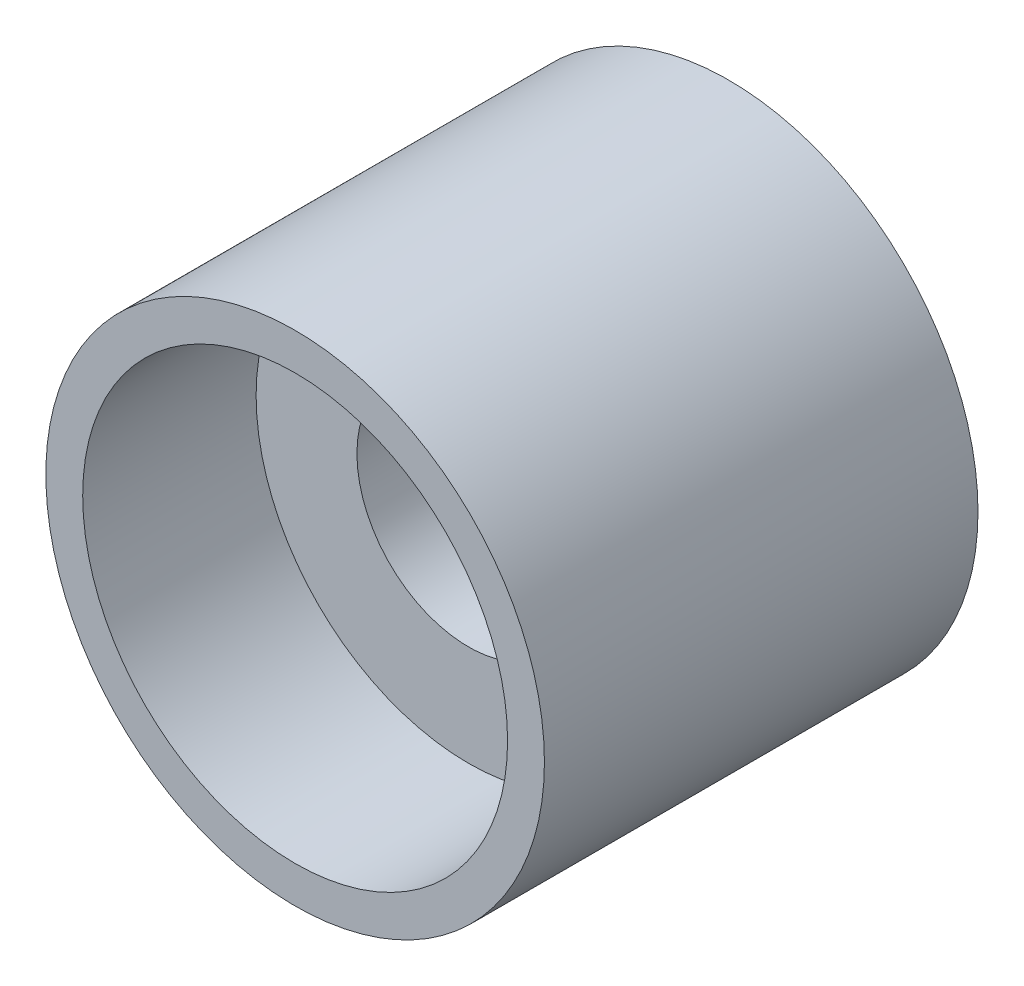
ISO-10303-21;
HEADER;
FILE_DESCRIPTION(('STEP AP214'),'2;1');
FILE_NAME('part.step','',(''),(''),'','','');
FILE_SCHEMA(('AUTOMOTIVE_DESIGN { 1 0 10303 214 1 1 1 1 }'));
ENDSEC;
DATA;
#1=APPLICATION_CONTEXT('core data for automotive mechanical design processes');
#2=APPLICATION_PROTOCOL_DEFINITION('international standard','automotive_design',2000,#1);
#3=PRODUCT_CONTEXT('',#1,'mechanical');
#4=PRODUCT('Part','Part','',(#3));
#5=PRODUCT_RELATED_PRODUCT_CATEGORY('part','',(#4));
#6=PRODUCT_DEFINITION_FORMATION('','',#4);
#7=PRODUCT_DEFINITION_CONTEXT('part definition',#1,'design');
#8=PRODUCT_DEFINITION('design','',#6,#7);
#9=PRODUCT_DEFINITION_SHAPE('','',#8);
#10=(LENGTH_UNIT() NAMED_UNIT(*) SI_UNIT(.MILLI.,.METRE.));
#11=(NAMED_UNIT(*) PLANE_ANGLE_UNIT() SI_UNIT($,.RADIAN.));
#12=(NAMED_UNIT(*) SI_UNIT($,.STERADIAN.) SOLID_ANGLE_UNIT());
#13=UNCERTAINTY_MEASURE_WITH_UNIT(LENGTH_MEASURE(1.E-05),#10,'distance_accuracy_value','');
#14=(GEOMETRIC_REPRESENTATION_CONTEXT(3) GLOBAL_UNCERTAINTY_ASSIGNED_CONTEXT((#13)) GLOBAL_UNIT_ASSIGNED_CONTEXT((#10,
#11,#12)) REPRESENTATION_CONTEXT('',''));
#15=CARTESIAN_POINT('',(0.,0.,0.));
#16=DIRECTION('',(0.,0.,1.));
#17=DIRECTION('',(1.,0.,0.));
#18=AXIS2_PLACEMENT_3D('',#15,#16,#17);
#19=CARTESIAN_POINT('',(0.,0.,20.));
#20=DIRECTION('',(0.,0.,-1.));
#21=DIRECTION('',(-1.,0.,0.));
#22=AXIS2_PLACEMENT_3D('',#19,#20,#21);
#23=CYLINDRICAL_SURFACE('',#22,5.15);
#24=CARTESIAN_POINT('',(0.,0.,0.));
#25=DIRECTION('',(0.,0.,1.));
#26=DIRECTION('',(1.,0.,0.));
#27=AXIS2_PLACEMENT_3D('',#24,#25,#26);
#28=CIRCLE('',#27,5.15);
#29=CARTESIAN_POINT('',(5.15,0.,0.));
#30=VERTEX_POINT('',#29);
#31=EDGE_CURVE('E44',#30,#30,#28,.T.);
#32=ORIENTED_EDGE('',*,*,#31,.F.);
#33=EDGE_LOOP('',(#32));
#34=FACE_BOUND('',#33,.T.);
#35=CARTESIAN_POINT('',(0.,0.,12.));
#36=DIRECTION('',(0.,0.,1.));
#37=DIRECTION('',(1.,0.,0.));
#38=AXIS2_PLACEMENT_3D('',#35,#36,#37);
#39=CIRCLE('',#38,5.15);
#40=CARTESIAN_POINT('',(5.15,0.,12.));
#41=VERTEX_POINT('',#40);
#42=EDGE_CURVE('E35',#41,#41,#39,.T.);
#43=ORIENTED_EDGE('',*,*,#42,.T.);
#44=EDGE_LOOP('',(#43));
#45=FACE_BOUND('',#44,.T.);
#46=ADVANCED_FACE('F31',(#34,#45),#23,.F.);
#47=CARTESIAN_POINT('',(0.,0.,20.));
#48=DIRECTION('',(0.,0.,1.));
#49=DIRECTION('',(1.,0.,0.));
#50=AXIS2_PLACEMENT_3D('',#47,#48,#49);
#51=PLANE('',#50);
#52=CARTESIAN_POINT('',(0.,0.,20.));
#53=DIRECTION('',(0.,0.,1.));
#54=DIRECTION('',(1.,0.,0.));
#55=AXIS2_PLACEMENT_3D('',#52,#53,#54);
#56=CIRCLE('',#55,9.8);
#57=CARTESIAN_POINT('',(9.8,0.,20.));
#58=VERTEX_POINT('',#57);
#59=EDGE_CURVE('E48',#58,#58,#56,.T.);
#60=ORIENTED_EDGE('',*,*,#59,.F.);
#61=EDGE_LOOP('',(#60));
#62=FACE_BOUND('',#61,.T.);
#63=CARTESIAN_POINT('',(0.,0.,20.));
#64=DIRECTION('',(0.,0.,1.));
#65=DIRECTION('',(1.,0.,0.));
#66=AXIS2_PLACEMENT_3D('',#63,#64,#65);
#67=CIRCLE('',#66,11.5);
#68=CARTESIAN_POINT('',(11.5,0.,20.));
#69=VERTEX_POINT('',#68);
#70=EDGE_CURVE('E10',#69,#69,#67,.T.);
#71=ORIENTED_EDGE('',*,*,#70,.T.);
#72=EDGE_LOOP('',(#71));
#73=FACE_BOUND('',#72,.T.);
#74=ADVANCED_FACE('F69',(#62,#73),#51,.T.);
#75=CARTESIAN_POINT('',(0.,0.,0.));
#76=DIRECTION('',(0.,0.,1.));
#77=DIRECTION('',(1.,0.,0.));
#78=AXIS2_PLACEMENT_3D('',#75,#76,#77);
#79=PLANE('',#78);
#80=CARTESIAN_POINT('',(0.,0.,0.));
#81=DIRECTION('',(0.,0.,1.));
#82=DIRECTION('',(1.,0.,0.));
#83=AXIS2_PLACEMENT_3D('',#80,#81,#82);
#84=CIRCLE('',#83,11.5);
#85=CARTESIAN_POINT('',(11.5,0.,0.));
#86=VERTEX_POINT('',#85);
#87=EDGE_CURVE('E39',#86,#86,#84,.T.);
#88=ORIENTED_EDGE('',*,*,#87,.F.);
#89=EDGE_LOOP('',(#88));
#90=FACE_BOUND('',#89,.T.);
#91=ORIENTED_EDGE('',*,*,#31,.T.);
#92=EDGE_LOOP('',(#91));
#93=FACE_BOUND('',#92,.T.);
#94=ADVANCED_FACE('F75',(#90,#93),#79,.F.);
#95=CARTESIAN_POINT('',(0.,0.,20.));
#96=DIRECTION('',(0.,0.,-1.));
#97=DIRECTION('',(-1.,0.,0.));
#98=AXIS2_PLACEMENT_3D('',#95,#96,#97);
#99=CYLINDRICAL_SURFACE('',#98,11.5);
#100=ORIENTED_EDGE('',*,*,#70,.F.);
#101=EDGE_LOOP('',(#100));
#102=FACE_BOUND('',#101,.T.);
#103=ORIENTED_EDGE('',*,*,#87,.T.);
#104=EDGE_LOOP('',(#103));
#105=FACE_BOUND('',#104,.T.);
#106=ADVANCED_FACE('F33',(#102,#105),#99,.T.);
#107=CARTESIAN_POINT('',(0.,0.,12.));
#108=DIRECTION('',(0.,0.,1.));
#109=DIRECTION('',(1.,0.,0.));
#110=AXIS2_PLACEMENT_3D('',#107,#108,#109);
#111=CYLINDRICAL_SURFACE('',#110,9.8);
#112=CARTESIAN_POINT('',(0.,0.,12.));
#113=DIRECTION('',(0.,0.,1.));
#114=DIRECTION('',(1.,0.,0.));
#115=AXIS2_PLACEMENT_3D('',#112,#113,#114);
#116=CIRCLE('',#115,9.8);
#117=CARTESIAN_POINT('',(9.8,0.,12.));
#118=VERTEX_POINT('',#117);
#119=EDGE_CURVE('E51',#118,#118,#116,.T.);
#120=ORIENTED_EDGE('',*,*,#119,.F.);
#121=EDGE_LOOP('',(#120));
#122=FACE_BOUND('',#121,.T.);
#123=ORIENTED_EDGE('',*,*,#59,.T.);
#124=EDGE_LOOP('',(#123));
#125=FACE_BOUND('',#124,.T.);
#126=ADVANCED_FACE('F61',(#122,#125),#111,.F.);
#127=CARTESIAN_POINT('',(0.,0.,12.));
#128=DIRECTION('',(0.,0.,1.));
#129=DIRECTION('',(1.,0.,0.));
#130=AXIS2_PLACEMENT_3D('',#127,#128,#129);
#131=PLANE('',#130);
#132=ORIENTED_EDGE('',*,*,#42,.F.);
#133=EDGE_LOOP('',(#132));
#134=FACE_BOUND('',#133,.T.);
#135=ORIENTED_EDGE('',*,*,#119,.T.);
#136=EDGE_LOOP('',(#135));
#137=FACE_BOUND('',#136,.T.);
#138=ADVANCED_FACE('F59',(#134,#137),#131,.T.);
#139=CLOSED_SHELL('',(#46,#74,#94,#106,#126,#138));
#140=MANIFOLD_SOLID_BREP('B2',#139);
#141=ADVANCED_BREP_SHAPE_REPRESENTATION('',(#18,#140),#14);
#142=SHAPE_DEFINITION_REPRESENTATION(#9,#141);
ENDSEC;
END-ISO-10303-21;
